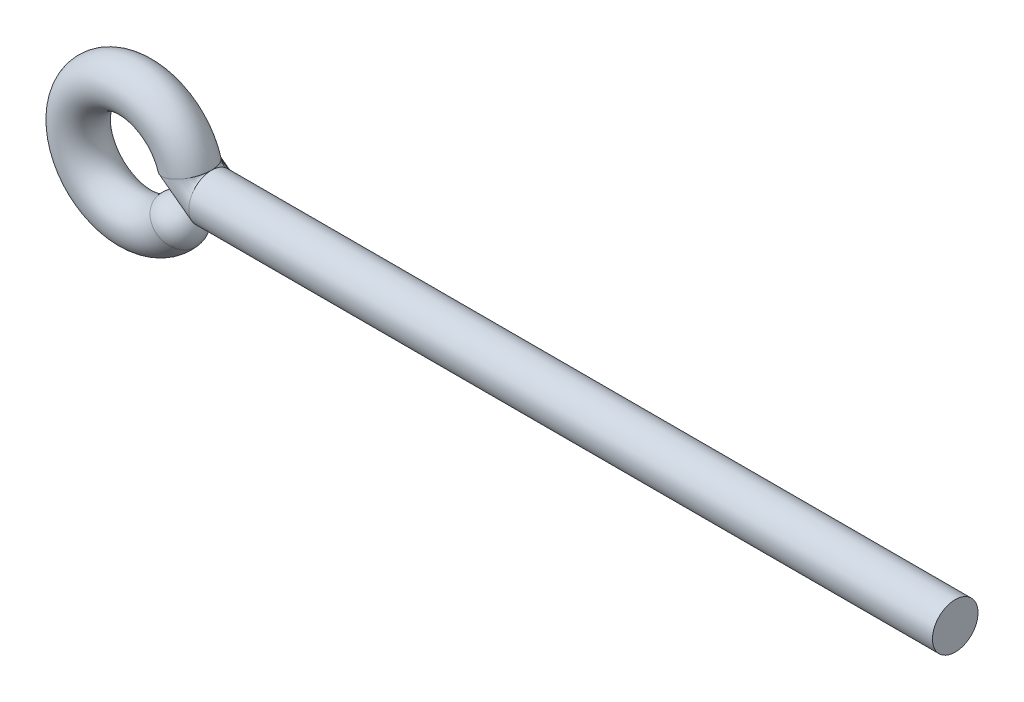
ISO-10303-21;
HEADER;
FILE_DESCRIPTION(('STEP AP214'),'2;1');
FILE_NAME('part.step','',(''),(''),'','','');
FILE_SCHEMA(('AUTOMOTIVE_DESIGN { 1 0 10303 214 1 1 1 1 }'));
ENDSEC;
DATA;
#1=APPLICATION_CONTEXT('core data for automotive mechanical design processes');
#2=APPLICATION_PROTOCOL_DEFINITION('international standard','automotive_design',2000,#1);
#3=PRODUCT_CONTEXT('',#1,'mechanical');
#4=PRODUCT('Part','Part','',(#3));
#5=PRODUCT_RELATED_PRODUCT_CATEGORY('part','',(#4));
#6=PRODUCT_DEFINITION_FORMATION('','',#4);
#7=PRODUCT_DEFINITION_CONTEXT('part definition',#1,'design');
#8=PRODUCT_DEFINITION('design','',#6,#7);
#9=PRODUCT_DEFINITION_SHAPE('','',#8);
#10=(LENGTH_UNIT() NAMED_UNIT(*) SI_UNIT(.MILLI.,.METRE.));
#11=(NAMED_UNIT(*) PLANE_ANGLE_UNIT() SI_UNIT($,.RADIAN.));
#12=(NAMED_UNIT(*) SI_UNIT($,.STERADIAN.) SOLID_ANGLE_UNIT());
#13=UNCERTAINTY_MEASURE_WITH_UNIT(LENGTH_MEASURE(1.E-05),#10,'distance_accuracy_value','');
#14=(GEOMETRIC_REPRESENTATION_CONTEXT(3) GLOBAL_UNCERTAINTY_ASSIGNED_CONTEXT((#13)) GLOBAL_UNIT_ASSIGNED_CONTEXT((#10,
#11,#12)) REPRESENTATION_CONTEXT('',''));
#15=CARTESIAN_POINT('',(0.,0.,0.));
#16=DIRECTION('',(0.,0.,1.));
#17=DIRECTION('',(1.,0.,0.));
#18=AXIS2_PLACEMENT_3D('',#15,#16,#17);
#19=CARTESIAN_POINT('',(-4.08488889220254,-1.60696902421634,0.));
#20=DIRECTION('',(0.,0.,1.));
#21=DIRECTION('',(1.,0.,0.));
#22=AXIS2_PLACEMENT_3D('',#19,#20,#21);
#23=SPHERICAL_SURFACE('',#22,1.);
#24=CARTESIAN_POINT('',(-4.08488889220254,-1.60696902421634,0.));
#25=DIRECTION('',(-0.642787609686535,-0.766044443118982,0.));
#26=DIRECTION('',(0.,0.,-1.));
#27=AXIS2_PLACEMENT_3D('',#24,#25,#26);
#28=SPHERICAL_SURFACE('',#27,1.);
#29=CARTESIAN_POINT('',(-4.08488889220254,-1.60696902421634,0.));
#30=DIRECTION('',(-0.642787609686535,-0.766044443118982,0.));
#31=DIRECTION('',(0.,0.,-1.));
#32=AXIS2_PLACEMENT_3D('',#29,#30,#31);
#33=CIRCLE('',#32,1.);
#34=CARTESIAN_POINT('',(-4.08488889220254,-1.60696902421634,-1.));
#35=VERTEX_POINT('',#34);
#36=EDGE_CURVE('E11',#35,#35,#33,.T.);
#37=ORIENTED_EDGE('',*,*,#36,.F.);
#38=EDGE_LOOP('',(#37));
#39=FACE_BOUND('',#38,.T.);
#40=ADVANCED_FACE('F33',(#39),#28,.T.);
#41=CARTESIAN_POINT('',(0.,0.,0.));
#42=DIRECTION('',(-1.,0.,0.));
#43=DIRECTION('',(0.,0.,1.));
#44=AXIS2_PLACEMENT_3D('',#41,#42,#43);
#45=CYLINDRICAL_SURFACE('',#44,1.);
#46=CARTESIAN_POINT('',(-2.64589803375031,0.,0.));
#47=DIRECTION('',(1.,0.,0.));
#48=DIRECTION('',(0.,0.,-1.));
#49=AXIS2_PLACEMENT_3D('',#46,#47,#48);
#50=CIRCLE('',#49,1.);
#51=CARTESIAN_POINT('',(-2.64589803375031,1.,0.));
#52=VERTEX_POINT('',#51);
#53=EDGE_CURVE('E48',#52,#52,#50,.T.);
#54=ORIENTED_EDGE('',*,*,#53,.T.);
#55=EDGE_LOOP('',(#54));
#56=FACE_BOUND('',#55,.T.);
#57=CARTESIAN_POINT('',(30.,0.,0.));
#58=DIRECTION('',(1.,0.,0.));
#59=DIRECTION('',(0.,0.,-1.));
#60=AXIS2_PLACEMENT_3D('',#57,#58,#59);
#61=CIRCLE('',#60,1.);
#62=CARTESIAN_POINT('',(30.,0.,-1.));
#63=VERTEX_POINT('',#62);
#64=EDGE_CURVE('E52',#63,#63,#61,.T.);
#65=ORIENTED_EDGE('',*,*,#64,.F.);
#66=EDGE_LOOP('',(#65));
#67=FACE_BOUND('',#66,.T.);
#68=ADVANCED_FACE('F60',(#56,#67),#45,.T.);
#69=CARTESIAN_POINT('',(-2.64589803375031,1.,0.));
#70=DIRECTION('',(0.,0.,-1.));
#71=DIRECTION('',(-1.,0.,0.));
#72=AXIS2_PLACEMENT_3D('',#69,#70,#71);
#73=DEGENERATE_TOROIDAL_SURFACE('',#72,1.,1.,.T.);
#74=CARTESIAN_POINT('',(-3.60421288125022,0.714285714285715,0.));
#75=DIRECTION('',(0.285714285714285,-0.95831484749991,0.));
#76=DIRECTION('',(0.,0.,-1.));
#77=AXIS2_PLACEMENT_3D('',#74,#75,#76);
#78=CIRCLE('',#77,1.);
#79=EDGE_CURVE('E40',#52,#52,#78,.T.);
#80=ORIENTED_EDGE('',*,*,#79,.T.);
#81=ORIENTED_EDGE('',*,*,#53,.F.);
#82=EDGE_LOOP('',(#80,#81));
#83=FACE_BOUND('',#82,.T.);
#84=ADVANCED_FACE('F49',(#83),#73,.T.);
#85=CARTESIAN_POINT('',(-6.,0.,0.));
#86=DIRECTION('',(0.,0.,1.));
#87=DIRECTION('',(1.,0.,0.));
#88=AXIS2_PLACEMENT_3D('',#85,#86,#87);
#89=TOROIDAL_SURFACE('',#88,2.5,1.);
#90=ORIENTED_EDGE('',*,*,#36,.T.);
#91=EDGE_LOOP('',(#90));
#92=FACE_BOUND('',#91,.T.);
#93=ORIENTED_EDGE('',*,*,#79,.F.);
#94=EDGE_LOOP('',(#93));
#95=FACE_BOUND('',#94,.T.);
#96=ADVANCED_FACE('F67',(#92,#95),#89,.T.);
#97=CARTESIAN_POINT('',(30.,0.,0.));
#98=DIRECTION('',(1.,0.,0.));
#99=DIRECTION('',(0.,0.,-1.));
#100=AXIS2_PLACEMENT_3D('',#97,#98,#99);
#101=PLANE('',#100);
#102=ORIENTED_EDGE('',*,*,#64,.T.);
#103=EDGE_LOOP('',(#102));
#104=FACE_BOUND('',#103,.T.);
#105=ADVANCED_FACE('F58',(#104),#101,.T.);
#106=CLOSED_SHELL('',(#40,#68,#84,#96,#105));
#107=MANIFOLD_SOLID_BREP('B2',#106);
#108=ADVANCED_BREP_SHAPE_REPRESENTATION('',(#18,#107),#14);
#109=SHAPE_DEFINITION_REPRESENTATION(#9,#108);
ENDSEC;
END-ISO-10303-21;
